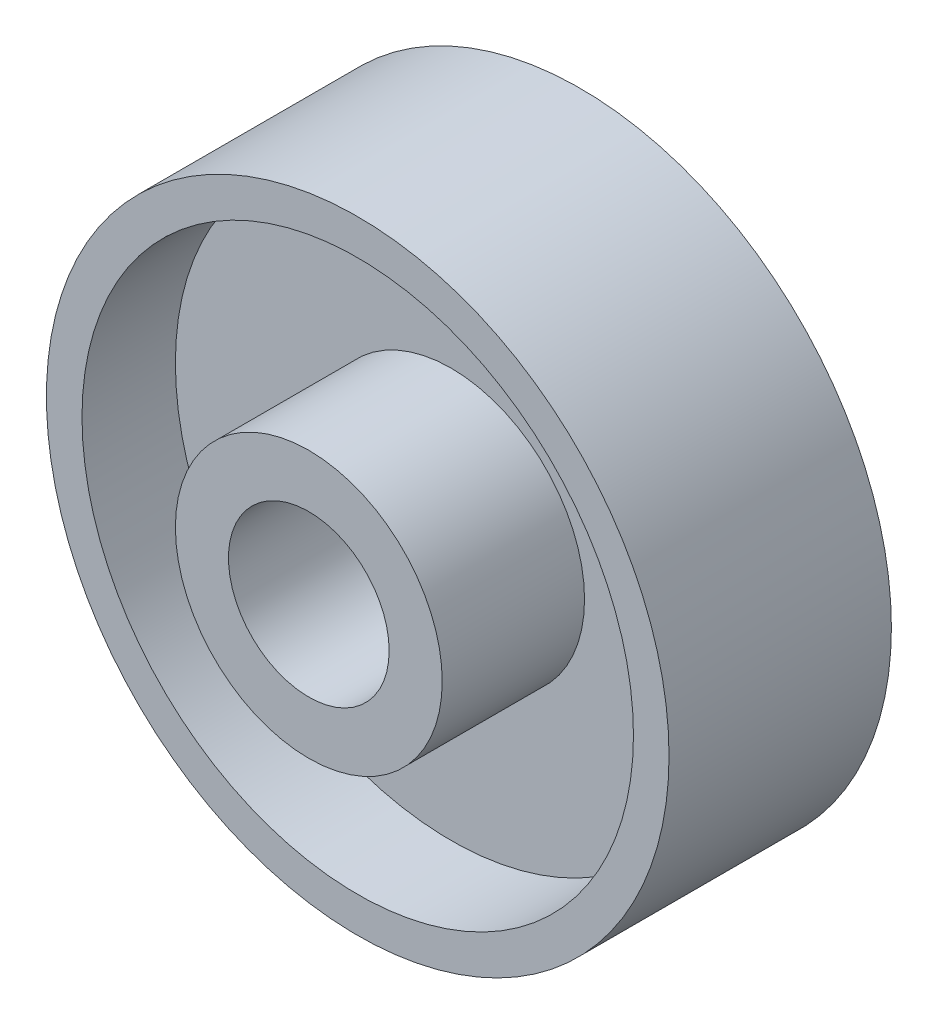
ISO-10303-21;
HEADER;
FILE_DESCRIPTION(('STEP AP214'),'2;1');
FILE_NAME('part.step','',(''),(''),'','','');
FILE_SCHEMA(('AUTOMOTIVE_DESIGN { 1 0 10303 214 1 1 1 1 }'));
ENDSEC;
DATA;
#1=APPLICATION_CONTEXT('core data for automotive mechanical design processes');
#2=APPLICATION_PROTOCOL_DEFINITION('international standard','automotive_design',2000,#1);
#3=PRODUCT_CONTEXT('',#1,'mechanical');
#4=PRODUCT('Part','Part','',(#3));
#5=PRODUCT_RELATED_PRODUCT_CATEGORY('part','',(#4));
#6=PRODUCT_DEFINITION_FORMATION('','',#4);
#7=PRODUCT_DEFINITION_CONTEXT('part definition',#1,'design');
#8=PRODUCT_DEFINITION('design','',#6,#7);
#9=PRODUCT_DEFINITION_SHAPE('','',#8);
#10=(LENGTH_UNIT() NAMED_UNIT(*) SI_UNIT(.MILLI.,.METRE.));
#11=(NAMED_UNIT(*) PLANE_ANGLE_UNIT() SI_UNIT($,.RADIAN.));
#12=(NAMED_UNIT(*) SI_UNIT($,.STERADIAN.) SOLID_ANGLE_UNIT());
#13=UNCERTAINTY_MEASURE_WITH_UNIT(LENGTH_MEASURE(1.E-05),#10,'distance_accuracy_value','');
#14=(GEOMETRIC_REPRESENTATION_CONTEXT(3) GLOBAL_UNCERTAINTY_ASSIGNED_CONTEXT((#13)) GLOBAL_UNIT_ASSIGNED_CONTEXT((#10,
#11,#12)) REPRESENTATION_CONTEXT('',''));
#15=CARTESIAN_POINT('',(0.,0.,0.));
#16=DIRECTION('',(0.,0.,1.));
#17=DIRECTION('',(1.,0.,0.));
#18=AXIS2_PLACEMENT_3D('',#15,#16,#17);
#19=CARTESIAN_POINT('',(0.,0.,-36.));
#20=DIRECTION('',(0.,0.,1.));
#21=DIRECTION('',(1.,0.,0.));
#22=AXIS2_PLACEMENT_3D('',#19,#20,#21);
#23=CYLINDRICAL_SURFACE('',#22,30.);
#24=CARTESIAN_POINT('',(0.,0.,-36.));
#25=DIRECTION('',(0.,0.,1.));
#26=DIRECTION('',(1.,0.,0.));
#27=AXIS2_PLACEMENT_3D('',#24,#25,#26);
#28=CIRCLE('',#27,30.);
#29=CARTESIAN_POINT('',(30.,0.,-36.));
#30=VERTEX_POINT('',#29);
#31=EDGE_CURVE('E44',#30,#30,#28,.T.);
#32=ORIENTED_EDGE('',*,*,#31,.T.);
#33=EDGE_LOOP('',(#32));
#34=FACE_BOUND('',#33,.T.);
#35=CARTESIAN_POINT('',(0.,0.,-4.));
#36=DIRECTION('',(0.,0.,1.));
#37=DIRECTION('',(1.,0.,0.));
#38=AXIS2_PLACEMENT_3D('',#35,#36,#37);
#39=CIRCLE('',#38,30.);
#40=CARTESIAN_POINT('',(30.,0.,-4.));
#41=VERTEX_POINT('',#40);
#42=EDGE_CURVE('E63',#41,#41,#39,.T.);
#43=ORIENTED_EDGE('',*,*,#42,.F.);
#44=EDGE_LOOP('',(#43));
#45=FACE_BOUND('',#44,.T.);
#46=ADVANCED_FACE('F37',(#34,#45),#23,.T.);
#47=CARTESIAN_POINT('',(0.,0.,-36.));
#48=DIRECTION('',(0.,0.,1.));
#49=DIRECTION('',(1.,0.,0.));
#50=AXIS2_PLACEMENT_3D('',#47,#48,#49);
#51=CYLINDRICAL_SURFACE('',#50,18.065);
#52=CARTESIAN_POINT('',(0.,0.,-36.));
#53=DIRECTION('',(0.,0.,1.));
#54=DIRECTION('',(1.,0.,0.));
#55=AXIS2_PLACEMENT_3D('',#52,#53,#54);
#56=CIRCLE('',#55,18.065);
#57=CARTESIAN_POINT('',(18.065,0.,-36.));
#58=VERTEX_POINT('',#57);
#59=EDGE_CURVE('E48',#58,#58,#56,.T.);
#60=ORIENTED_EDGE('',*,*,#59,.F.);
#61=EDGE_LOOP('',(#60));
#62=FACE_BOUND('',#61,.T.);
#63=CARTESIAN_POINT('',(0.,0.,36.));
#64=DIRECTION('',(0.,0.,1.));
#65=DIRECTION('',(1.,0.,0.));
#66=AXIS2_PLACEMENT_3D('',#63,#64,#65);
#67=CIRCLE('',#66,18.065);
#68=CARTESIAN_POINT('',(18.065,0.,36.));
#69=VERTEX_POINT('',#68);
#70=EDGE_CURVE('E57',#69,#69,#67,.T.);
#71=ORIENTED_EDGE('',*,*,#70,.T.);
#72=EDGE_LOOP('',(#71));
#73=FACE_BOUND('',#72,.T.);
#74=ADVANCED_FACE('F39',(#62,#73),#51,.F.);
#75=CARTESIAN_POINT('',(0.,0.,4.));
#76=DIRECTION('',(0.,0.,1.));
#77=DIRECTION('',(1.,0.,0.));
#78=AXIS2_PLACEMENT_3D('',#75,#76,#77);
#79=CIRCLE('',#78,30.);
#80=CARTESIAN_POINT('',(30.,0.,4.));
#81=VERTEX_POINT('',#80);
#82=EDGE_CURVE('E10',#81,#81,#79,.F.);
#83=ORIENTED_EDGE('',*,*,#82,.F.);
#84=EDGE_LOOP('',(#83));
#85=FACE_BOUND('',#84,.T.);
#86=CARTESIAN_POINT('',(0.,0.,36.));
#87=DIRECTION('',(0.,0.,1.));
#88=DIRECTION('',(1.,0.,0.));
#89=AXIS2_PLACEMENT_3D('',#86,#87,#88);
#90=CIRCLE('',#89,30.);
#91=CARTESIAN_POINT('',(30.,0.,36.));
#92=VERTEX_POINT('',#91);
#93=EDGE_CURVE('E52',#92,#92,#90,.T.);
#94=ORIENTED_EDGE('',*,*,#93,.F.);
#95=EDGE_LOOP('',(#94));
#96=FACE_BOUND('',#95,.T.);
#97=ADVANCED_FACE('F105',(#85,#96),#23,.T.);
#98=CARTESIAN_POINT('',(0.,0.,-36.));
#99=DIRECTION('',(0.,0.,1.));
#100=DIRECTION('',(1.,0.,0.));
#101=AXIS2_PLACEMENT_3D('',#98,#99,#100);
#102=PLANE('',#101);
#103=ORIENTED_EDGE('',*,*,#59,.T.);
#104=EDGE_LOOP('',(#103));
#105=FACE_BOUND('',#104,.T.);
#106=ORIENTED_EDGE('',*,*,#31,.F.);
#107=EDGE_LOOP('',(#106));
#108=FACE_BOUND('',#107,.T.);
#109=ADVANCED_FACE('F113',(#105,#108),#102,.F.);
#110=CARTESIAN_POINT('',(0.,0.,36.));
#111=DIRECTION('',(0.,0.,1.));
#112=DIRECTION('',(1.,0.,0.));
#113=AXIS2_PLACEMENT_3D('',#110,#111,#112);
#114=PLANE('',#113);
#115=ORIENTED_EDGE('',*,*,#70,.F.);
#116=EDGE_LOOP('',(#115));
#117=FACE_BOUND('',#116,.T.);
#118=ORIENTED_EDGE('',*,*,#93,.T.);
#119=EDGE_LOOP('',(#118));
#120=FACE_BOUND('',#119,.T.);
#121=ADVANCED_FACE('F118',(#117,#120),#114,.T.);
#122=CARTESIAN_POINT('',(0.,0.,-4.));
#123=DIRECTION('',(0.,0.,1.));
#124=DIRECTION('',(1.,0.,0.));
#125=AXIS2_PLACEMENT_3D('',#122,#123,#124);
#126=PLANE('',#125);
#127=ORIENTED_EDGE('',*,*,#42,.T.);
#128=EDGE_LOOP('',(#127));
#129=FACE_BOUND('',#128,.T.);
#130=CARTESIAN_POINT('',(0.,0.,-4.));
#131=DIRECTION('',(0.,0.,1.));
#132=DIRECTION('',(1.,0.,0.));
#133=AXIS2_PLACEMENT_3D('',#130,#131,#132);
#134=CIRCLE('',#133,62.);
#135=CARTESIAN_POINT('',(62.,0.,-4.));
#136=VERTEX_POINT('',#135);
#137=EDGE_CURVE('E60',#136,#136,#134,.T.);
#138=ORIENTED_EDGE('',*,*,#137,.F.);
#139=EDGE_LOOP('',(#138));
#140=FACE_BOUND('',#139,.T.);
#141=ADVANCED_FACE('F124',(#129,#140),#126,.F.);
#142=CARTESIAN_POINT('',(0.,0.,4.));
#143=DIRECTION('',(0.,0.,1.));
#144=DIRECTION('',(1.,0.,0.));
#145=AXIS2_PLACEMENT_3D('',#142,#143,#144);
#146=PLANE('',#145);
#147=ORIENTED_EDGE('',*,*,#82,.T.);
#148=EDGE_LOOP('',(#147));
#149=FACE_BOUND('',#148,.T.);
#150=CARTESIAN_POINT('',(0.,0.,4.));
#151=DIRECTION('',(0.,0.,1.));
#152=DIRECTION('',(1.,0.,0.));
#153=AXIS2_PLACEMENT_3D('',#150,#151,#152);
#154=CIRCLE('',#153,62.);
#155=CARTESIAN_POINT('',(62.,0.,4.));
#156=VERTEX_POINT('',#155);
#157=EDGE_CURVE('E66',#156,#156,#154,.T.);
#158=ORIENTED_EDGE('',*,*,#157,.T.);
#159=EDGE_LOOP('',(#158));
#160=FACE_BOUND('',#159,.T.);
#161=ADVANCED_FACE('F130',(#149,#160),#146,.T.);
#162=CARTESIAN_POINT('',(0.,0.,-25.));
#163=DIRECTION('',(0.,0.,1.));
#164=DIRECTION('',(1.,0.,0.));
#165=AXIS2_PLACEMENT_3D('',#162,#163,#164);
#166=CYLINDRICAL_SURFACE('',#165,62.);
#167=CARTESIAN_POINT('',(0.,0.,-25.));
#168=DIRECTION('',(0.,0.,1.));
#169=DIRECTION('',(1.,0.,0.));
#170=AXIS2_PLACEMENT_3D('',#167,#168,#169);
#171=CIRCLE('',#170,62.);
#172=CARTESIAN_POINT('',(62.,0.,-25.));
#173=VERTEX_POINT('',#172);
#174=EDGE_CURVE('E72',#173,#173,#171,.T.);
#175=ORIENTED_EDGE('',*,*,#174,.F.);
#176=EDGE_LOOP('',(#175));
#177=FACE_BOUND('',#176,.T.);
#178=ORIENTED_EDGE('',*,*,#137,.T.);
#179=EDGE_LOOP('',(#178));
#180=FACE_BOUND('',#179,.T.);
#181=ADVANCED_FACE('F101',(#177,#180),#166,.F.);
#182=ORIENTED_EDGE('',*,*,#157,.F.);
#183=EDGE_LOOP('',(#182));
#184=FACE_BOUND('',#183,.T.);
#185=CARTESIAN_POINT('',(0.,0.,25.));
#186=DIRECTION('',(0.,0.,1.));
#187=DIRECTION('',(1.,0.,0.));
#188=AXIS2_PLACEMENT_3D('',#185,#186,#187);
#189=CIRCLE('',#188,62.);
#190=CARTESIAN_POINT('',(62.,0.,25.));
#191=VERTEX_POINT('',#190);
#192=EDGE_CURVE('E78',#191,#191,#189,.T.);
#193=ORIENTED_EDGE('',*,*,#192,.T.);
#194=EDGE_LOOP('',(#193));
#195=FACE_BOUND('',#194,.T.);
#196=ADVANCED_FACE('F82',(#184,#195),#166,.F.);
#197=CARTESIAN_POINT('',(0.,0.,-25.));
#198=DIRECTION('',(0.,0.,1.));
#199=DIRECTION('',(1.,0.,0.));
#200=AXIS2_PLACEMENT_3D('',#197,#198,#199);
#201=CYLINDRICAL_SURFACE('',#200,70.);
#202=CARTESIAN_POINT('',(0.,0.,-25.));
#203=DIRECTION('',(0.,0.,1.));
#204=DIRECTION('',(1.,0.,0.));
#205=AXIS2_PLACEMENT_3D('',#202,#203,#204);
#206=CIRCLE('',#205,70.);
#207=CARTESIAN_POINT('',(70.,0.,-25.));
#208=VERTEX_POINT('',#207);
#209=EDGE_CURVE('E69',#208,#208,#206,.T.);
#210=ORIENTED_EDGE('',*,*,#209,.T.);
#211=EDGE_LOOP('',(#210));
#212=FACE_BOUND('',#211,.T.);
#213=CARTESIAN_POINT('',(0.,0.,25.));
#214=DIRECTION('',(0.,0.,1.));
#215=DIRECTION('',(1.,0.,0.));
#216=AXIS2_PLACEMENT_3D('',#213,#214,#215);
#217=CIRCLE('',#216,70.);
#218=CARTESIAN_POINT('',(70.,0.,25.));
#219=VERTEX_POINT('',#218);
#220=EDGE_CURVE('E75',#219,#219,#217,.T.);
#221=ORIENTED_EDGE('',*,*,#220,.F.);
#222=EDGE_LOOP('',(#221));
#223=FACE_BOUND('',#222,.T.);
#224=ADVANCED_FACE('F91',(#212,#223),#201,.T.);
#225=CARTESIAN_POINT('',(0.,0.,-25.));
#226=DIRECTION('',(0.,0.,1.));
#227=DIRECTION('',(1.,0.,0.));
#228=AXIS2_PLACEMENT_3D('',#225,#226,#227);
#229=PLANE('',#228);
#230=ORIENTED_EDGE('',*,*,#174,.T.);
#231=EDGE_LOOP('',(#230));
#232=FACE_BOUND('',#231,.T.);
#233=ORIENTED_EDGE('',*,*,#209,.F.);
#234=EDGE_LOOP('',(#233));
#235=FACE_BOUND('',#234,.T.);
#236=ADVANCED_FACE('F87',(#232,#235),#229,.F.);
#237=CARTESIAN_POINT('',(0.,0.,25.));
#238=DIRECTION('',(0.,0.,1.));
#239=DIRECTION('',(1.,0.,0.));
#240=AXIS2_PLACEMENT_3D('',#237,#238,#239);
#241=PLANE('',#240);
#242=ORIENTED_EDGE('',*,*,#192,.F.);
#243=EDGE_LOOP('',(#242));
#244=FACE_BOUND('',#243,.T.);
#245=ORIENTED_EDGE('',*,*,#220,.T.);
#246=EDGE_LOOP('',(#245));
#247=FACE_BOUND('',#246,.T.);
#248=ADVANCED_FACE('F84',(#244,#247),#241,.T.);
#249=CLOSED_SHELL('',(#46,#74,#97,#109,#121,#141,#161,#181,#196,#224,#236,#248));
#250=MANIFOLD_SOLID_BREP('B2',#249);
#251=ADVANCED_BREP_SHAPE_REPRESENTATION('',(#18,#250),#14);
#252=SHAPE_DEFINITION_REPRESENTATION(#9,#251);
ENDSEC;
END-ISO-10303-21;
